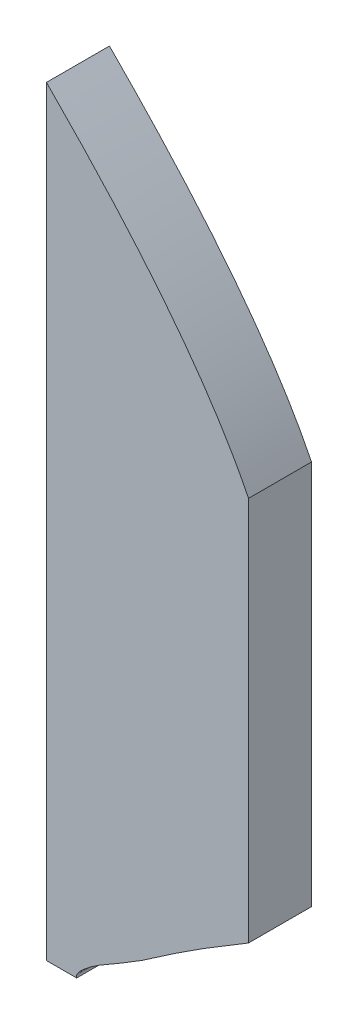
ISO-10303-21;
HEADER;
FILE_DESCRIPTION(('STEP AP214'),'2;1');
FILE_NAME('part.step','',(''),(''),'','','');
FILE_SCHEMA(('AUTOMOTIVE_DESIGN { 1 0 10303 214 1 1 1 1 }'));
ENDSEC;
DATA;
#1=APPLICATION_CONTEXT('core data for automotive mechanical design processes');
#2=APPLICATION_PROTOCOL_DEFINITION('international standard','automotive_design',2000,#1);
#3=PRODUCT_CONTEXT('',#1,'mechanical');
#4=PRODUCT('Part','Part','',(#3));
#5=PRODUCT_RELATED_PRODUCT_CATEGORY('part','',(#4));
#6=PRODUCT_DEFINITION_FORMATION('','',#4);
#7=PRODUCT_DEFINITION_CONTEXT('part definition',#1,'design');
#8=PRODUCT_DEFINITION('design','',#6,#7);
#9=PRODUCT_DEFINITION_SHAPE('','',#8);
#10=(LENGTH_UNIT() NAMED_UNIT(*) SI_UNIT(.MILLI.,.METRE.));
#11=(NAMED_UNIT(*) PLANE_ANGLE_UNIT() SI_UNIT($,.RADIAN.));
#12=(NAMED_UNIT(*) SI_UNIT($,.STERADIAN.) SOLID_ANGLE_UNIT());
#13=UNCERTAINTY_MEASURE_WITH_UNIT(LENGTH_MEASURE(1.E-05),#10,'distance_accuracy_value','');
#14=(GEOMETRIC_REPRESENTATION_CONTEXT(3) GLOBAL_UNCERTAINTY_ASSIGNED_CONTEXT((#13)) GLOBAL_UNIT_ASSIGNED_CONTEXT((#10,
#11,#12)) REPRESENTATION_CONTEXT('',''));
#15=CARTESIAN_POINT('',(0.,0.,0.));
#16=DIRECTION('',(0.,0.,1.));
#17=DIRECTION('',(1.,0.,0.));
#18=AXIS2_PLACEMENT_3D('',#15,#16,#17);
#19=CARTESIAN_POINT('',(-89.8462129274997,-123.639652012805,43.9999999999997));
#20=CARTESIAN_POINT('',(-88.5675191928989,-123.638851315084,43.9999999999997));
#21=CARTESIAN_POINT('',(-87.2888254707394,-123.638030447592,43.9999999999997));
#22=CARTESIAN_POINT('',(-86.0101317632375,-123.637187583947,43.9999999999997));
#23=B_SPLINE_CURVE_WITH_KNOTS('',3,(#19,#20,#21,#22),.UNSPECIFIED.,.F.,.F.,(4,4),(0.,1.),.UNSPECIFIED.);
#24=DIRECTION('',(0.,0.,1.));
#25=VECTOR('',#24,1.);
#26=SURFACE_OF_LINEAR_EXTRUSION('',#23,#25);
#27=CARTESIAN_POINT('',(-86.0101317632375,-123.637187583947,51.9999999999997));
#28=CARTESIAN_POINT('',(-87.2888254707394,-123.638030447592,51.9999999999997));
#29=CARTESIAN_POINT('',(-88.5675191928989,-123.638851315084,51.9999999999997));
#30=CARTESIAN_POINT('',(-89.8462129274997,-123.639652012805,51.9999999999997));
#31=B_SPLINE_CURVE_WITH_KNOTS('',3,(#27,#28,#29,#30),.UNSPECIFIED.,.F.,.F.,(4,4),(0.,1.),.UNSPECIFIED.);
#32=CARTESIAN_POINT('',(-89.8462129274997,-123.639652012805,51.9999999999997));
#33=VERTEX_POINT('',#32);
#34=CARTESIAN_POINT('',(-86.0101317632375,-123.637187583947,51.9999999999997));
#35=VERTEX_POINT('',#34);
#36=EDGE_CURVE('E234',#33,#35,#31,.F.);
#37=ORIENTED_EDGE('',*,*,#36,.F.);
#38=DIRECTION('',(0.,0.,1.));
#39=VECTOR('',#38,1.);
#40=CARTESIAN_POINT('',(-89.8462129274997,-123.639652012805,43.9999999999997));
#41=LINE('',#40,#39);
#42=CARTESIAN_POINT('',(-89.8462129274997,-123.639652012805,43.9999999999997));
#43=VERTEX_POINT('',#42);
#44=EDGE_CURVE('E11',#43,#33,#41,.T.);
#45=ORIENTED_EDGE('',*,*,#44,.F.);
#46=CARTESIAN_POINT('',(-89.8462129274997,-123.639652012805,43.9999999999997));
#47=CARTESIAN_POINT('',(-88.5675191928989,-123.638851315084,43.9999999999997));
#48=CARTESIAN_POINT('',(-87.2888254707394,-123.638030447592,43.9999999999997));
#49=CARTESIAN_POINT('',(-86.0101317632375,-123.637187583947,43.9999999999997));
#50=B_SPLINE_CURVE_WITH_KNOTS('',3,(#46,#47,#48,#49),.UNSPECIFIED.,.F.,.F.,(4,4),(0.,1.),.UNSPECIFIED.);
#51=CARTESIAN_POINT('',(-86.0101317632375,-123.637187583947,43.9999999999997));
#52=VERTEX_POINT('',#51);
#53=EDGE_CURVE('E110',#43,#52,#50,.T.);
#54=ORIENTED_EDGE('',*,*,#53,.T.);
#55=DIRECTION('',(0.,0.,1.));
#56=VECTOR('',#55,1.);
#57=CARTESIAN_POINT('',(-86.0101317632375,-123.637187583947,43.9999999999997));
#58=LINE('',#57,#56);
#59=EDGE_CURVE('E80',#52,#35,#58,.T.);
#60=ORIENTED_EDGE('',*,*,#59,.T.);
#61=EDGE_LOOP('',(#37,#45,#54,#60));
#62=FACE_BOUND('',#61,.T.);
#63=ADVANCED_FACE('F30',(#62),#26,.T.);
#64=CARTESIAN_POINT('',(-89.8464617022665,-27.022340146681,43.9999999999997));
#65=DIRECTION('',(-0.999999999996685,-2.57484670141603E-06,0.));
#66=DIRECTION('',(2.57484670141603E-06,-0.999999999996685,0.));
#67=AXIS2_PLACEMENT_3D('',#64,#65,#66);
#68=PLANE('',#67);
#69=DIRECTION('',(2.57484670141603E-06,-0.999999999996685,0.));
#70=VECTOR('',#69,1.);
#71=CARTESIAN_POINT('',(-89.8464617022665,-27.022340146681,51.9999999999997));
#72=LINE('',#71,#70);
#73=CARTESIAN_POINT('',(-89.8464617022665,-27.022340146681,51.9999999999997));
#74=VERTEX_POINT('',#73);
#75=EDGE_CURVE('E209',#74,#33,#72,.T.);
#76=ORIENTED_EDGE('',*,*,#75,.F.);
#77=DIRECTION('',(0.,0.,1.));
#78=VECTOR('',#77,1.);
#79=CARTESIAN_POINT('',(-89.8464617022665,-27.022340146681,43.9999999999997));
#80=LINE('',#79,#78);
#81=CARTESIAN_POINT('',(-89.8464617022665,-27.022340146681,43.9999999999997));
#82=VERTEX_POINT('',#81);
#83=EDGE_CURVE('E42',#82,#74,#80,.T.);
#84=ORIENTED_EDGE('',*,*,#83,.F.);
#85=DIRECTION('',(2.57484670141603E-06,-0.999999999996685,0.));
#86=VECTOR('',#85,1.);
#87=CARTESIAN_POINT('',(-89.8464617022665,-27.022340146681,43.9999999999997));
#88=LINE('',#87,#86);
#89=EDGE_CURVE('E104',#82,#43,#88,.T.);
#90=ORIENTED_EDGE('',*,*,#89,.T.);
#91=ORIENTED_EDGE('',*,*,#44,.T.);
#92=EDGE_LOOP('',(#76,#84,#90,#91));
#93=FACE_BOUND('',#92,.T.);
#94=ADVANCED_FACE('F140',(#93),#68,.T.);
#95=CARTESIAN_POINT('',(-64.176185141697,-59.9493075624093,43.9999999999997));
#96=CARTESIAN_POINT('',(-64.9494593860574,-58.3809765005845,43.9999999999997));
#97=CARTESIAN_POINT('',(-65.7873908943083,-56.8521123956506,43.9999999999997));
#98=CARTESIAN_POINT('',(-67.5616653339097,-53.854454766555,43.9999999999997));
#99=CARTESIAN_POINT('',(-68.4982322589943,-52.3857979687334,43.9999999999997));
#100=CARTESIAN_POINT('',(-70.4491717565078,-49.4959771363905,43.9999999999997));
#101=CARTESIAN_POINT('',(-71.4635222118847,-48.074799601565,43.9999999999997));
#102=CARTESIAN_POINT('',(-73.5568240405058,-45.2718770950504,43.9999999999997));
#103=CARTESIAN_POINT('',(-74.6373233190224,-43.8884255927567,43.9999999999997));
#104=CARTESIAN_POINT('',(-77.9469399890866,-39.8057457545483,43.9999999999997));
#105=CARTESIAN_POINT('',(-80.2459081017361,-37.1720413871869,43.9999999999997));
#106=CARTESIAN_POINT('',(-84.9661826677041,-32.021056361404,43.9999999999997));
#107=CARTESIAN_POINT('',(-87.3866629728189,-29.5029894961605,43.9999999999997));
#108=CARTESIAN_POINT('',(-89.8464617022665,-27.022340146681,43.9999999999997));
#109=B_SPLINE_CURVE_WITH_KNOTS('',3,(#95,#96,#97,#98,#99,#100,#101,#102,#103,#104,#105,#106,
#107,#108),.UNSPECIFIED.,.F.,.F.,(4,2,2,2,2,2,4),(0.,0.125,0.25,0.375,0.5,0.75,1.),.UNSPECIFIED.);
#110=DIRECTION('',(0.,0.,1.));
#111=VECTOR('',#110,1.);
#112=SURFACE_OF_LINEAR_EXTRUSION('',#109,#111);
#113=CARTESIAN_POINT('',(-89.8464617022665,-27.022340146681,51.9999999999997));
#114=CARTESIAN_POINT('',(-87.3866629728189,-29.5029894961605,51.9999999999997));
#115=CARTESIAN_POINT('',(-84.9661826677041,-32.021056361404,51.9999999999997));
#116=CARTESIAN_POINT('',(-80.2459081017361,-37.1720413871869,51.9999999999997));
#117=CARTESIAN_POINT('',(-77.9469399890866,-39.8057457545483,51.9999999999997));
#118=CARTESIAN_POINT('',(-74.6373233190224,-43.8884255927567,51.9999999999997));
#119=CARTESIAN_POINT('',(-73.5568240405058,-45.2718770950504,51.9999999999997));
#120=CARTESIAN_POINT('',(-71.4635222118847,-48.074799601565,51.9999999999997));
#121=CARTESIAN_POINT('',(-70.4491717565078,-49.4959771363905,51.9999999999997));
#122=CARTESIAN_POINT('',(-68.4982322589943,-52.3857979687334,51.9999999999997));
#123=CARTESIAN_POINT('',(-67.5616653339097,-53.854454766555,51.9999999999997));
#124=CARTESIAN_POINT('',(-65.7873908943083,-56.8521123956506,51.9999999999997));
#125=CARTESIAN_POINT('',(-64.9494593860574,-58.3809765005845,51.9999999999997));
#126=CARTESIAN_POINT('',(-64.176185141697,-59.9493075624093,51.9999999999997));
#127=B_SPLINE_CURVE_WITH_KNOTS('',3,(#113,#114,#115,#116,#117,#118,#119,#120,#121,#122,#123,
#124,#125,#126),.UNSPECIFIED.,.F.,.F.,(4,2,2,2,2,2,4),(0.,0.25,0.5,0.625,0.75,0.875,1.),.UNSPECIFIED.);
#128=CARTESIAN_POINT('',(-64.176185141697,-59.9493075624093,51.9999999999997));
#129=VERTEX_POINT('',#128);
#130=EDGE_CURVE('E91',#129,#74,#127,.F.);
#131=ORIENTED_EDGE('',*,*,#130,.F.);
#132=DIRECTION('',(0.,0.,1.));
#133=VECTOR('',#132,1.);
#134=CARTESIAN_POINT('',(-64.176185141697,-59.9493075624093,43.9999999999997));
#135=LINE('',#134,#133);
#136=CARTESIAN_POINT('',(-64.176185141697,-59.9493075624093,43.9999999999997));
#137=VERTEX_POINT('',#136);
#138=EDGE_CURVE('E85',#137,#129,#135,.T.);
#139=ORIENTED_EDGE('',*,*,#138,.F.);
#140=CARTESIAN_POINT('',(-64.176185141697,-59.9493075624093,43.9999999999997));
#141=CARTESIAN_POINT('',(-64.9494593860574,-58.3809765005845,43.9999999999997));
#142=CARTESIAN_POINT('',(-65.7873908943083,-56.8521123956506,43.9999999999997));
#143=CARTESIAN_POINT('',(-67.5616653339097,-53.854454766555,43.9999999999997));
#144=CARTESIAN_POINT('',(-68.4982322589943,-52.3857979687334,43.9999999999997));
#145=CARTESIAN_POINT('',(-70.4491717565078,-49.4959771363905,43.9999999999997));
#146=CARTESIAN_POINT('',(-71.4635222118847,-48.074799601565,43.9999999999997));
#147=CARTESIAN_POINT('',(-73.5568240405058,-45.2718770950504,43.9999999999997));
#148=CARTESIAN_POINT('',(-74.6373233190224,-43.8884255927567,43.9999999999997));
#149=CARTESIAN_POINT('',(-77.9469399890866,-39.8057457545483,43.9999999999997));
#150=CARTESIAN_POINT('',(-80.2459081017361,-37.1720413871869,43.9999999999997));
#151=CARTESIAN_POINT('',(-84.9661826677041,-32.021056361404,43.9999999999997));
#152=CARTESIAN_POINT('',(-87.3866629728189,-29.5029894961605,43.9999999999997));
#153=CARTESIAN_POINT('',(-89.8464617022665,-27.022340146681,43.9999999999997));
#154=B_SPLINE_CURVE_WITH_KNOTS('',3,(#140,#141,#142,#143,#144,#145,#146,#147,#148,#149,#150,
#151,#152,#153),.UNSPECIFIED.,.F.,.F.,(4,2,2,2,2,2,4),(0.,0.125,0.25,0.375,0.5,0.75,1.),.UNSPECIFIED.);
#155=EDGE_CURVE('E88',#137,#82,#154,.T.);
#156=ORIENTED_EDGE('',*,*,#155,.T.);
#157=ORIENTED_EDGE('',*,*,#83,.T.);
#158=EDGE_LOOP('',(#131,#139,#156,#157));
#159=FACE_BOUND('',#158,.T.);
#160=ADVANCED_FACE('F87',(#159),#112,.T.);
#161=CARTESIAN_POINT('',(-64.1761851416973,-108.871065378928,43.9999999999997));
#162=DIRECTION('',(1.,0.,0.));
#163=DIRECTION('',(0.,1.,0.));
#164=AXIS2_PLACEMENT_3D('',#161,#162,#163);
#165=PLANE('',#164);
#166=DIRECTION('',(0.,1.,0.));
#167=VECTOR('',#166,1.);
#168=CARTESIAN_POINT('',(-64.1761851416973,-108.871065378928,51.9999999999997));
#169=LINE('',#168,#167);
#170=CARTESIAN_POINT('',(-64.1761851416973,-108.871065378928,51.9999999999997));
#171=VERTEX_POINT('',#170);
#172=EDGE_CURVE('E200',#171,#129,#169,.T.);
#173=ORIENTED_EDGE('',*,*,#172,.F.);
#174=DIRECTION('',(0.,0.,1.));
#175=VECTOR('',#174,1.);
#176=CARTESIAN_POINT('',(-64.1761851416973,-108.871065378928,43.9999999999997));
#177=LINE('',#176,#175);
#178=CARTESIAN_POINT('',(-64.1761851416973,-108.871065378928,43.9999999999997));
#179=VERTEX_POINT('',#178);
#180=EDGE_CURVE('E97',#179,#171,#177,.T.);
#181=ORIENTED_EDGE('',*,*,#180,.F.);
#182=DIRECTION('',(0.,1.,0.));
#183=VECTOR('',#182,1.);
#184=CARTESIAN_POINT('',(-64.1761851416973,-108.871065378928,43.9999999999997));
#185=LINE('',#184,#183);
#186=EDGE_CURVE('E103',#179,#137,#185,.T.);
#187=ORIENTED_EDGE('',*,*,#186,.T.);
#188=ORIENTED_EDGE('',*,*,#138,.T.);
#189=EDGE_LOOP('',(#173,#181,#187,#188));
#190=FACE_BOUND('',#189,.T.);
#191=ADVANCED_FACE('F107',(#190),#165,.T.);
#192=CARTESIAN_POINT('',(-86.0101317632375,-123.637187583947,43.9999999999997));
#193=CARTESIAN_POINT('',(-86.0367862138601,-123.571345149146,43.9999999999997));
#194=CARTESIAN_POINT('',(-86.044215143227,-123.499318381211,43.9999999999997));
#195=CARTESIAN_POINT('',(-86.0273363992769,-123.359862426357,43.9999999999997));
#196=CARTESIAN_POINT('',(-86.0041082569721,-123.29181787242,43.9999999999997));
#197=CARTESIAN_POINT('',(-85.9155554708859,-123.101118636989,43.9999999999997));
#198=CARTESIAN_POINT('',(-85.8328581360746,-122.985158975475,43.9999999999997));
#199=CARTESIAN_POINT('',(-85.6576440463531,-122.768585301712,43.9999999999997));
#200=CARTESIAN_POINT('',(-85.5623624919996,-122.667328707009,43.9999999999997));
#201=CARTESIAN_POINT('',(-85.3667237949648,-122.469465015421,43.9999999999997));
#202=CARTESIAN_POINT('',(-85.2659584775177,-122.373231827443,43.9999999999997));
#203=CARTESIAN_POINT('',(-84.9556266930473,-122.091893495653,43.9999999999997));
#204=CARTESIAN_POINT('',(-84.7402447822317,-121.916598412659,43.9999999999997));
#205=CARTESIAN_POINT('',(-84.3018339099844,-121.577774420043,43.9999999999997));
#206=CARTESIAN_POINT('',(-84.0772457435607,-121.416377444687,43.9999999999997));
#207=CARTESIAN_POINT('',(-83.39269806411,-120.948242945421,43.9999999999997));
#208=CARTESIAN_POINT('',(-82.9219967674154,-120.657500207865,43.9999999999997));
#209=CARTESIAN_POINT('',(-81.9702975261765,-120.091346700668,43.9999999999997));
#210=CARTESIAN_POINT('',(-81.4889798821699,-119.816405358574,43.9999999999997));
#211=CARTESIAN_POINT('',(-80.5271510438589,-119.265418009366,43.9999999999997));
#212=CARTESIAN_POINT('',(-80.0466769667087,-118.98923493975,43.9999999999997));
#213=CARTESIAN_POINT('',(-79.0943782001431,-118.423327406123,43.9999999999997));
#214=CARTESIAN_POINT('',(-78.6221112883108,-118.134295281078,43.9999999999997));
#215=CARTESIAN_POINT('',(-77.2194319892759,-117.245090527128,43.9999999999997));
#216=CARTESIAN_POINT('',(-76.3059983830075,-116.618336089659,43.9999999999997));
#217=CARTESIAN_POINT('',(-74.9426256862209,-115.66759331479,43.9999999999997));
#218=CARTESIAN_POINT('',(-74.4888077352431,-115.349677682292,43.9999999999997));
#219=CARTESIAN_POINT('',(-73.5753589546473,-114.722947001597,43.9999999999997));
#220=CARTESIAN_POINT('',(-73.1160137000711,-114.413684859988,43.9999999999997));
#221=CARTESIAN_POINT('',(-71.7297831680392,-113.49872808195,43.9999999999997));
#222=CARTESIAN_POINT('',(-70.7964787771773,-112.903083144871,43.9999999999997));
#223=CARTESIAN_POINT('',(-68.9189359952442,-111.728911431407,43.9999999999997));
#224=CARTESIAN_POINT('',(-67.9746665477973,-111.15041962495,43.9999999999997));
#225=CARTESIAN_POINT('',(-66.0796993751552,-110.003555533501,43.9999999999997));
#226=CARTESIAN_POINT('',(-65.1297004435927,-109.434353645312,43.9999999999997));
#227=CARTESIAN_POINT('',(-64.1761851416969,-108.871065378927,43.9999999999997));
#228=B_SPLINE_CURVE_WITH_KNOTS('',3,(#192,#193,#194,#195,#196,#197,#198,#199,#200,#201,#202,
#203,#204,#205,#206,#207,#208,#209,#210,#211,#212,#213,#214,#215,#216,#217,#218,#219,#220,#221,
#222,#223,#224,#225,#226,#227),.UNSPECIFIED.,.F.,.F.,(4,2,2,2,2,2,2,2,2,2,2,2,2,2,2,2,2,4),(0.,
0.00781250000000025,0.0156250000000005,0.031250000000001,0.0468750000000015,0.062500000000002,
0.0937500000000018,0.125000000000002,0.187500000000001,0.250000000000001,0.312500000000001,
0.375,0.5,0.5625,0.624999999999999,0.75,0.875,1.),.UNSPECIFIED.);
#229=DIRECTION('',(0.,0.,1.));
#230=VECTOR('',#229,1.);
#231=SURFACE_OF_LINEAR_EXTRUSION('',#228,#230);
#232=CARTESIAN_POINT('',(-64.1761851416969,-108.871065378927,51.9999999999997));
#233=CARTESIAN_POINT('',(-65.1297004435927,-109.434353645312,51.9999999999997));
#234=CARTESIAN_POINT('',(-66.0796993751552,-110.003555533501,51.9999999999997));
#235=CARTESIAN_POINT('',(-67.9746665477973,-111.15041962495,51.9999999999997));
#236=CARTESIAN_POINT('',(-68.9189359952442,-111.728911431407,51.9999999999997));
#237=CARTESIAN_POINT('',(-70.7964787771773,-112.903083144871,51.9999999999997));
#238=CARTESIAN_POINT('',(-71.7297831680392,-113.49872808195,51.9999999999997));
#239=CARTESIAN_POINT('',(-73.1160137000711,-114.413684859988,51.9999999999997));
#240=CARTESIAN_POINT('',(-73.5753589546473,-114.722947001597,51.9999999999997));
#241=CARTESIAN_POINT('',(-74.4888077352431,-115.349677682292,51.9999999999997));
#242=CARTESIAN_POINT('',(-74.9426256862209,-115.66759331479,51.9999999999997));
#243=CARTESIAN_POINT('',(-76.3059983830075,-116.618336089659,51.9999999999997));
#244=CARTESIAN_POINT('',(-77.2194319892759,-117.245090527128,51.9999999999997));
#245=CARTESIAN_POINT('',(-78.6221112883108,-118.134295281078,51.9999999999997));
#246=CARTESIAN_POINT('',(-79.0943782001431,-118.423327406123,51.9999999999997));
#247=CARTESIAN_POINT('',(-80.0466769667087,-118.98923493975,51.9999999999997));
#248=CARTESIAN_POINT('',(-80.5271510438589,-119.265418009366,51.9999999999997));
#249=CARTESIAN_POINT('',(-81.4889798821699,-119.816405358574,51.9999999999997));
#250=CARTESIAN_POINT('',(-81.9702975261765,-120.091346700668,51.9999999999997));
#251=CARTESIAN_POINT('',(-82.9219967674154,-120.657500207865,51.9999999999997));
#252=CARTESIAN_POINT('',(-83.39269806411,-120.948242945421,51.9999999999997));
#253=CARTESIAN_POINT('',(-84.0772457435607,-121.416377444687,51.9999999999997));
#254=CARTESIAN_POINT('',(-84.3018339099844,-121.577774420043,51.9999999999997));
#255=CARTESIAN_POINT('',(-84.7402447822317,-121.916598412659,51.9999999999997));
#256=CARTESIAN_POINT('',(-84.9556266930473,-122.091893495653,51.9999999999997));
#257=CARTESIAN_POINT('',(-85.2659584775177,-122.373231827443,51.9999999999997));
#258=CARTESIAN_POINT('',(-85.3667237949648,-122.469465015421,51.9999999999997));
#259=CARTESIAN_POINT('',(-85.5623624919996,-122.667328707009,51.9999999999997));
#260=CARTESIAN_POINT('',(-85.6576440463531,-122.768585301712,51.9999999999997));
#261=CARTESIAN_POINT('',(-85.8328581360746,-122.985158975475,51.9999999999997));
#262=CARTESIAN_POINT('',(-85.9155554708859,-123.101118636989,51.9999999999997));
#263=CARTESIAN_POINT('',(-86.0041082569721,-123.29181787242,51.9999999999997));
#264=CARTESIAN_POINT('',(-86.0273363992769,-123.359862426357,51.9999999999997));
#265=CARTESIAN_POINT('',(-86.044215143227,-123.499318381211,51.9999999999997));
#266=CARTESIAN_POINT('',(-86.0367862138601,-123.571345149146,51.9999999999997));
#267=CARTESIAN_POINT('',(-86.0101317632375,-123.637187583947,51.9999999999997));
#268=B_SPLINE_CURVE_WITH_KNOTS('',3,(#232,#233,#234,#235,#236,#237,#238,#239,#240,#241,#242,
#243,#244,#245,#246,#247,#248,#249,#250,#251,#252,#253,#254,#255,#256,#257,#258,#259,#260,#261,
#262,#263,#264,#265,#266,#267),.UNSPECIFIED.,.F.,.F.,(4,2,2,2,2,2,2,2,2,2,2,2,2,2,2,2,2,4),(0.,
0.125,0.25,0.375000000000001,0.4375,0.5,0.625,0.687499999999999,0.749999999999999,
0.812499999999999,0.874999999999998,0.906249999999998,0.937499999999998,0.953124999999999,
0.968749999999999,0.984375,0.9921875,1.),.UNSPECIFIED.);
#269=EDGE_CURVE('E158',#35,#171,#268,.F.);
#270=ORIENTED_EDGE('',*,*,#269,.F.);
#271=ORIENTED_EDGE('',*,*,#59,.F.);
#272=CARTESIAN_POINT('',(-86.0101317632375,-123.637187583947,43.9999999999997));
#273=CARTESIAN_POINT('',(-86.0367862138601,-123.571345149146,43.9999999999997));
#274=CARTESIAN_POINT('',(-86.044215143227,-123.499318381211,43.9999999999997));
#275=CARTESIAN_POINT('',(-86.0273363992769,-123.359862426357,43.9999999999997));
#276=CARTESIAN_POINT('',(-86.0041082569721,-123.29181787242,43.9999999999997));
#277=CARTESIAN_POINT('',(-85.9155554708859,-123.101118636989,43.9999999999997));
#278=CARTESIAN_POINT('',(-85.8328581360746,-122.985158975475,43.9999999999997));
#279=CARTESIAN_POINT('',(-85.6576440463531,-122.768585301712,43.9999999999997));
#280=CARTESIAN_POINT('',(-85.5623624919996,-122.667328707009,43.9999999999997));
#281=CARTESIAN_POINT('',(-85.3667237949648,-122.469465015421,43.9999999999997));
#282=CARTESIAN_POINT('',(-85.2659584775177,-122.373231827443,43.9999999999997));
#283=CARTESIAN_POINT('',(-84.9556266930473,-122.091893495653,43.9999999999997));
#284=CARTESIAN_POINT('',(-84.7402447822317,-121.916598412659,43.9999999999997));
#285=CARTESIAN_POINT('',(-84.3018339099844,-121.577774420043,43.9999999999997));
#286=CARTESIAN_POINT('',(-84.0772457435607,-121.416377444687,43.9999999999997));
#287=CARTESIAN_POINT('',(-83.39269806411,-120.948242945421,43.9999999999997));
#288=CARTESIAN_POINT('',(-82.9219967674154,-120.657500207865,43.9999999999997));
#289=CARTESIAN_POINT('',(-81.9702975261765,-120.091346700668,43.9999999999997));
#290=CARTESIAN_POINT('',(-81.4889798821699,-119.816405358574,43.9999999999997));
#291=CARTESIAN_POINT('',(-80.5271510438589,-119.265418009366,43.9999999999997));
#292=CARTESIAN_POINT('',(-80.0466769667087,-118.98923493975,43.9999999999997));
#293=CARTESIAN_POINT('',(-79.0943782001431,-118.423327406123,43.9999999999997));
#294=CARTESIAN_POINT('',(-78.6221112883108,-118.134295281078,43.9999999999997));
#295=CARTESIAN_POINT('',(-77.2194319892759,-117.245090527128,43.9999999999997));
#296=CARTESIAN_POINT('',(-76.3059983830075,-116.618336089659,43.9999999999997));
#297=CARTESIAN_POINT('',(-74.9426256862209,-115.66759331479,43.9999999999997));
#298=CARTESIAN_POINT('',(-74.4888077352431,-115.349677682292,43.9999999999997));
#299=CARTESIAN_POINT('',(-73.5753589546473,-114.722947001597,43.9999999999997));
#300=CARTESIAN_POINT('',(-73.1160137000711,-114.413684859988,43.9999999999997));
#301=CARTESIAN_POINT('',(-71.7297831680392,-113.49872808195,43.9999999999997));
#302=CARTESIAN_POINT('',(-70.7964787771773,-112.903083144871,43.9999999999997));
#303=CARTESIAN_POINT('',(-68.9189359952442,-111.728911431407,43.9999999999997));
#304=CARTESIAN_POINT('',(-67.9746665477973,-111.15041962495,43.9999999999997));
#305=CARTESIAN_POINT('',(-66.0796993751552,-110.003555533501,43.9999999999997));
#306=CARTESIAN_POINT('',(-65.1297004435927,-109.434353645312,43.9999999999997));
#307=CARTESIAN_POINT('',(-64.1761851416969,-108.871065378927,43.9999999999997));
#308=B_SPLINE_CURVE_WITH_KNOTS('',3,(#272,#273,#274,#275,#276,#277,#278,#279,#280,#281,#282,
#283,#284,#285,#286,#287,#288,#289,#290,#291,#292,#293,#294,#295,#296,#297,#298,#299,#300,#301,
#302,#303,#304,#305,#306,#307),.UNSPECIFIED.,.F.,.F.,(4,2,2,2,2,2,2,2,2,2,2,2,2,2,2,2,2,4),(0.,
0.00781250000000025,0.0156250000000005,0.031250000000001,0.0468750000000015,0.062500000000002,
0.0937500000000018,0.125000000000002,0.187500000000001,0.250000000000001,0.312500000000001,
0.375,0.5,0.5625,0.624999999999999,0.75,0.875,1.),.UNSPECIFIED.);
#309=EDGE_CURVE('E108',#52,#179,#308,.T.);
#310=ORIENTED_EDGE('',*,*,#309,.T.);
#311=ORIENTED_EDGE('',*,*,#180,.T.);
#312=EDGE_LOOP('',(#270,#271,#310,#311));
#313=FACE_BOUND('',#312,.T.);
#314=ADVANCED_FACE('F164',(#313),#231,.T.);
#315=CARTESIAN_POINT('',(-87.9281723352065,-123.638435610597,43.9999999999997));
#316=DIRECTION('',(0.,0.,-1.));
#317=DIRECTION('',(-1.,0.,0.));
#318=AXIS2_PLACEMENT_3D('',#315,#316,#317);
#319=PLANE('',#318);
#320=ORIENTED_EDGE('',*,*,#53,.F.);
#321=ORIENTED_EDGE('',*,*,#89,.F.);
#322=ORIENTED_EDGE('',*,*,#155,.F.);
#323=ORIENTED_EDGE('',*,*,#186,.F.);
#324=ORIENTED_EDGE('',*,*,#309,.F.);
#325=EDGE_LOOP('',(#320,#321,#322,#323,#324));
#326=FACE_BOUND('',#325,.T.);
#327=ADVANCED_FACE('F102',(#326),#319,.T.);
#328=CARTESIAN_POINT('',(-87.9281723352065,-123.638435610597,51.9999999999997));
#329=DIRECTION('',(0.,0.,-1.));
#330=DIRECTION('',(-1.,0.,0.));
#331=AXIS2_PLACEMENT_3D('',#328,#329,#330);
#332=PLANE('',#331);
#333=ORIENTED_EDGE('',*,*,#36,.T.);
#334=ORIENTED_EDGE('',*,*,#269,.T.);
#335=ORIENTED_EDGE('',*,*,#172,.T.);
#336=ORIENTED_EDGE('',*,*,#130,.T.);
#337=ORIENTED_EDGE('',*,*,#75,.T.);
#338=EDGE_LOOP('',(#333,#334,#335,#336,#337));
#339=FACE_BOUND('',#338,.T.);
#340=ADVANCED_FACE('F129',(#339),#332,.F.);
#341=CLOSED_SHELL('',(#63,#94,#160,#191,#314,#327,#340));
#342=MANIFOLD_SOLID_BREP('B2',#341);
#343=ADVANCED_BREP_SHAPE_REPRESENTATION('',(#18,#342),#14);
#344=SHAPE_DEFINITION_REPRESENTATION(#9,#343);
ENDSEC;
END-ISO-10303-21;
